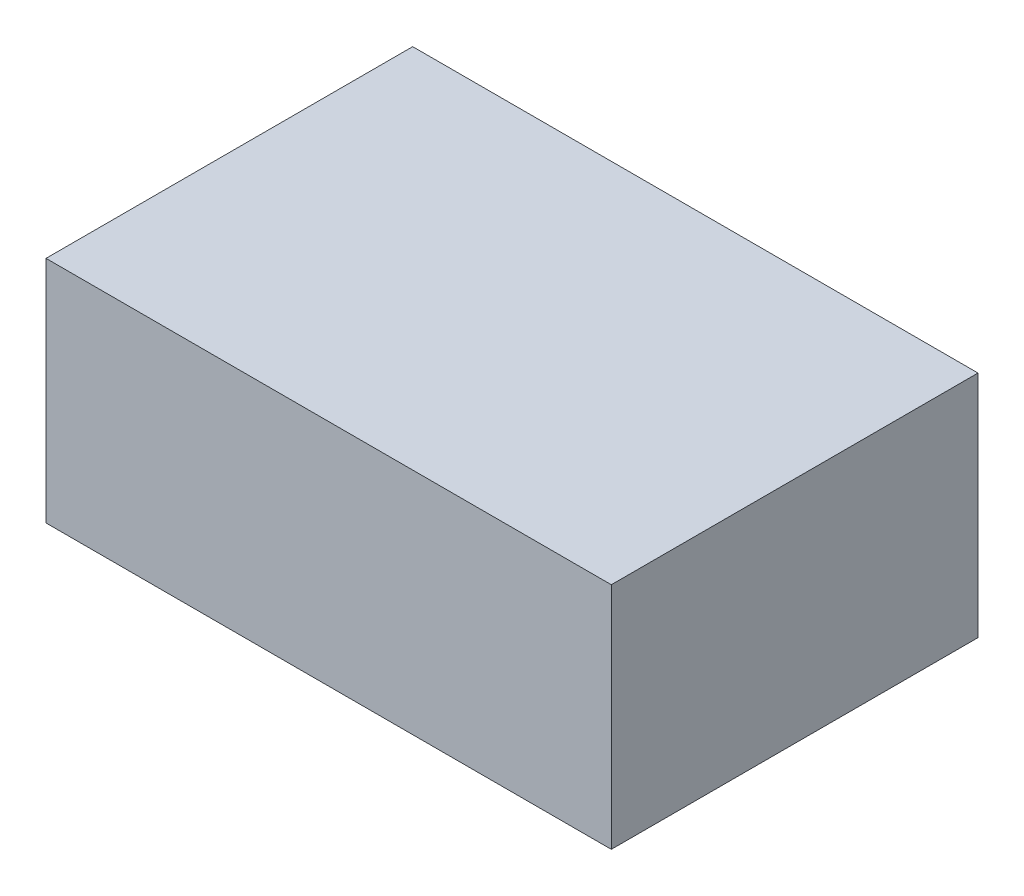
ISO-10303-21;
HEADER;
FILE_DESCRIPTION(('STEP AP214'),'2;1');
FILE_NAME('part.step','',(''),(''),'','','');
FILE_SCHEMA(('AUTOMOTIVE_DESIGN { 1 0 10303 214 1 1 1 1 }'));
ENDSEC;
DATA;
#1=APPLICATION_CONTEXT('core data for automotive mechanical design processes');
#2=APPLICATION_PROTOCOL_DEFINITION('international standard','automotive_design',2000,#1);
#3=PRODUCT_CONTEXT('',#1,'mechanical');
#4=PRODUCT('Part','Part','',(#3));
#5=PRODUCT_RELATED_PRODUCT_CATEGORY('part','',(#4));
#6=PRODUCT_DEFINITION_FORMATION('','',#4);
#7=PRODUCT_DEFINITION_CONTEXT('part definition',#1,'design');
#8=PRODUCT_DEFINITION('design','',#6,#7);
#9=PRODUCT_DEFINITION_SHAPE('','',#8);
#10=(LENGTH_UNIT() NAMED_UNIT(*) SI_UNIT(.MILLI.,.METRE.));
#11=(NAMED_UNIT(*) PLANE_ANGLE_UNIT() SI_UNIT($,.RADIAN.));
#12=(NAMED_UNIT(*) SI_UNIT($,.STERADIAN.) SOLID_ANGLE_UNIT());
#13=UNCERTAINTY_MEASURE_WITH_UNIT(LENGTH_MEASURE(1.E-05),#10,'distance_accuracy_value','');
#14=(GEOMETRIC_REPRESENTATION_CONTEXT(3) GLOBAL_UNCERTAINTY_ASSIGNED_CONTEXT((#13)) GLOBAL_UNIT_ASSIGNED_CONTEXT((#10,
#11,#12)) REPRESENTATION_CONTEXT('',''));
#15=CARTESIAN_POINT('',(0.,0.,0.));
#16=DIRECTION('',(0.,0.,1.));
#17=DIRECTION('',(1.,0.,0.));
#18=AXIS2_PLACEMENT_3D('',#15,#16,#17);
#19=CARTESIAN_POINT('',(0.,15.,0.));
#20=DIRECTION('',(1.,0.,0.));
#21=DIRECTION('',(0.,0.,-1.));
#22=AXIS2_PLACEMENT_3D('',#19,#20,#21);
#23=PLANE('',#22);
#24=DIRECTION('',(0.,0.,1.));
#25=VECTOR('',#24,1.);
#26=CARTESIAN_POINT('',(0.,0.,0.));
#27=LINE('',#26,#25);
#28=CARTESIAN_POINT('',(0.,0.,-24.));
#29=VERTEX_POINT('',#28);
#30=CARTESIAN_POINT('',(0.,0.,0.));
#31=VERTEX_POINT('',#30);
#32=EDGE_CURVE('E96',#29,#31,#27,.T.);
#33=ORIENTED_EDGE('',*,*,#32,.T.);
#34=DIRECTION('',(0.,-1.,0.));
#35=VECTOR('',#34,1.);
#36=CARTESIAN_POINT('',(0.,15.,0.));
#37=LINE('',#36,#35);
#38=CARTESIAN_POINT('',(0.,15.,0.));
#39=VERTEX_POINT('',#38);
#40=EDGE_CURVE('E11',#39,#31,#37,.T.);
#41=ORIENTED_EDGE('',*,*,#40,.F.);
#42=DIRECTION('',(0.,0.,1.));
#43=VECTOR('',#42,1.);
#44=CARTESIAN_POINT('',(0.,15.,0.));
#45=LINE('',#44,#43);
#46=CARTESIAN_POINT('',(0.,15.,-24.));
#47=VERTEX_POINT('',#46);
#48=EDGE_CURVE('E84',#47,#39,#45,.T.);
#49=ORIENTED_EDGE('',*,*,#48,.F.);
#50=DIRECTION('',(0.,-1.,0.));
#51=VECTOR('',#50,1.);
#52=CARTESIAN_POINT('',(0.,15.,-24.));
#53=LINE('',#52,#51);
#54=EDGE_CURVE('E92',#47,#29,#53,.T.);
#55=ORIENTED_EDGE('',*,*,#54,.T.);
#56=EDGE_LOOP('',(#33,#41,#49,#55));
#57=FACE_BOUND('',#56,.T.);
#58=ADVANCED_FACE('F33',(#57),#23,.F.);
#59=CARTESIAN_POINT('',(0.,15.,0.));
#60=DIRECTION('',(0.,0.,-1.));
#61=DIRECTION('',(-1.,0.,0.));
#62=AXIS2_PLACEMENT_3D('',#59,#60,#61);
#63=PLANE('',#62);
#64=DIRECTION('',(1.,0.,0.));
#65=VECTOR('',#64,1.);
#66=CARTESIAN_POINT('',(0.,0.,0.));
#67=LINE('',#66,#65);
#68=CARTESIAN_POINT('',(37.,0.,0.));
#69=VERTEX_POINT('',#68);
#70=EDGE_CURVE('E88',#31,#69,#67,.T.);
#71=ORIENTED_EDGE('',*,*,#70,.T.);
#72=DIRECTION('',(0.,-1.,0.));
#73=VECTOR('',#72,1.);
#74=CARTESIAN_POINT('',(37.,15.,0.));
#75=LINE('',#74,#73);
#76=CARTESIAN_POINT('',(37.,15.,0.));
#77=VERTEX_POINT('',#76);
#78=EDGE_CURVE('E41',#77,#69,#75,.T.);
#79=ORIENTED_EDGE('',*,*,#78,.F.);
#80=DIRECTION('',(1.,0.,0.));
#81=VECTOR('',#80,1.);
#82=CARTESIAN_POINT('',(0.,15.,0.));
#83=LINE('',#82,#81);
#84=EDGE_CURVE('E79',#39,#77,#83,.T.);
#85=ORIENTED_EDGE('',*,*,#84,.F.);
#86=ORIENTED_EDGE('',*,*,#40,.T.);
#87=EDGE_LOOP('',(#71,#79,#85,#86));
#88=FACE_BOUND('',#87,.T.);
#89=ADVANCED_FACE('F87',(#88),#63,.F.);
#90=CARTESIAN_POINT('',(37.,15.,0.));
#91=DIRECTION('',(-1.,0.,0.));
#92=DIRECTION('',(0.,0.,1.));
#93=AXIS2_PLACEMENT_3D('',#90,#91,#92);
#94=PLANE('',#93);
#95=DIRECTION('',(0.,0.,-1.));
#96=VECTOR('',#95,1.);
#97=CARTESIAN_POINT('',(37.,0.,0.));
#98=LINE('',#97,#96);
#99=CARTESIAN_POINT('',(37.,0.,-24.));
#100=VERTEX_POINT('',#99);
#101=EDGE_CURVE('E66',#69,#100,#98,.T.);
#102=ORIENTED_EDGE('',*,*,#101,.T.);
#103=DIRECTION('',(0.,-1.,0.));
#104=VECTOR('',#103,1.);
#105=CARTESIAN_POINT('',(37.,15.,-24.));
#106=LINE('',#105,#104);
#107=CARTESIAN_POINT('',(37.,15.,-24.));
#108=VERTEX_POINT('',#107);
#109=EDGE_CURVE('E89',#108,#100,#106,.T.);
#110=ORIENTED_EDGE('',*,*,#109,.F.);
#111=DIRECTION('',(0.,0.,-1.));
#112=VECTOR('',#111,1.);
#113=CARTESIAN_POINT('',(37.,15.,0.));
#114=LINE('',#113,#112);
#115=EDGE_CURVE('E82',#77,#108,#114,.T.);
#116=ORIENTED_EDGE('',*,*,#115,.F.);
#117=ORIENTED_EDGE('',*,*,#78,.T.);
#118=EDGE_LOOP('',(#102,#110,#116,#117));
#119=FACE_BOUND('',#118,.T.);
#120=ADVANCED_FACE('F90',(#119),#94,.F.);
#121=CARTESIAN_POINT('',(0.,15.,-24.));
#122=DIRECTION('',(0.,0.,1.));
#123=DIRECTION('',(1.,0.,0.));
#124=AXIS2_PLACEMENT_3D('',#121,#122,#123);
#125=PLANE('',#124);
#126=DIRECTION('',(-1.,0.,0.));
#127=VECTOR('',#126,1.);
#128=CARTESIAN_POINT('',(0.,0.,-24.));
#129=LINE('',#128,#127);
#130=EDGE_CURVE('E72',#100,#29,#129,.T.);
#131=ORIENTED_EDGE('',*,*,#130,.T.);
#132=ORIENTED_EDGE('',*,*,#54,.F.);
#133=DIRECTION('',(-1.,0.,0.));
#134=VECTOR('',#133,1.);
#135=CARTESIAN_POINT('',(0.,15.,-24.));
#136=LINE('',#135,#134);
#137=EDGE_CURVE('E49',#108,#47,#136,.T.);
#138=ORIENTED_EDGE('',*,*,#137,.F.);
#139=ORIENTED_EDGE('',*,*,#109,.T.);
#140=EDGE_LOOP('',(#131,#132,#138,#139));
#141=FACE_BOUND('',#140,.T.);
#142=ADVANCED_FACE('F103',(#141),#125,.F.);
#143=CARTESIAN_POINT('',(0.,15.,0.));
#144=DIRECTION('',(0.,-1.,0.));
#145=DIRECTION('',(0.,0.,-1.));
#146=AXIS2_PLACEMENT_3D('',#143,#144,#145);
#147=PLANE('',#146);
#148=ORIENTED_EDGE('',*,*,#48,.T.);
#149=ORIENTED_EDGE('',*,*,#84,.T.);
#150=ORIENTED_EDGE('',*,*,#115,.T.);
#151=ORIENTED_EDGE('',*,*,#137,.T.);
#152=EDGE_LOOP('',(#148,#149,#150,#151));
#153=FACE_BOUND('',#152,.T.);
#154=ADVANCED_FACE('F80',(#153),#147,.F.);
#155=CARTESIAN_POINT('',(0.,0.,0.));
#156=DIRECTION('',(0.,-1.,0.));
#157=DIRECTION('',(0.,0.,-1.));
#158=AXIS2_PLACEMENT_3D('',#155,#156,#157);
#159=PLANE('',#158);
#160=ORIENTED_EDGE('',*,*,#32,.F.);
#161=ORIENTED_EDGE('',*,*,#130,.F.);
#162=ORIENTED_EDGE('',*,*,#101,.F.);
#163=ORIENTED_EDGE('',*,*,#70,.F.);
#164=EDGE_LOOP('',(#160,#161,#162,#163));
#165=FACE_BOUND('',#164,.T.);
#166=ADVANCED_FACE('F106',(#165),#159,.T.);
#167=CLOSED_SHELL('',(#58,#89,#120,#142,#154,#166));
#168=MANIFOLD_SOLID_BREP('B2',#167);
#169=ADVANCED_BREP_SHAPE_REPRESENTATION('',(#18,#168),#14);
#170=SHAPE_DEFINITION_REPRESENTATION(#9,#169);
ENDSEC;
END-ISO-10303-21;
